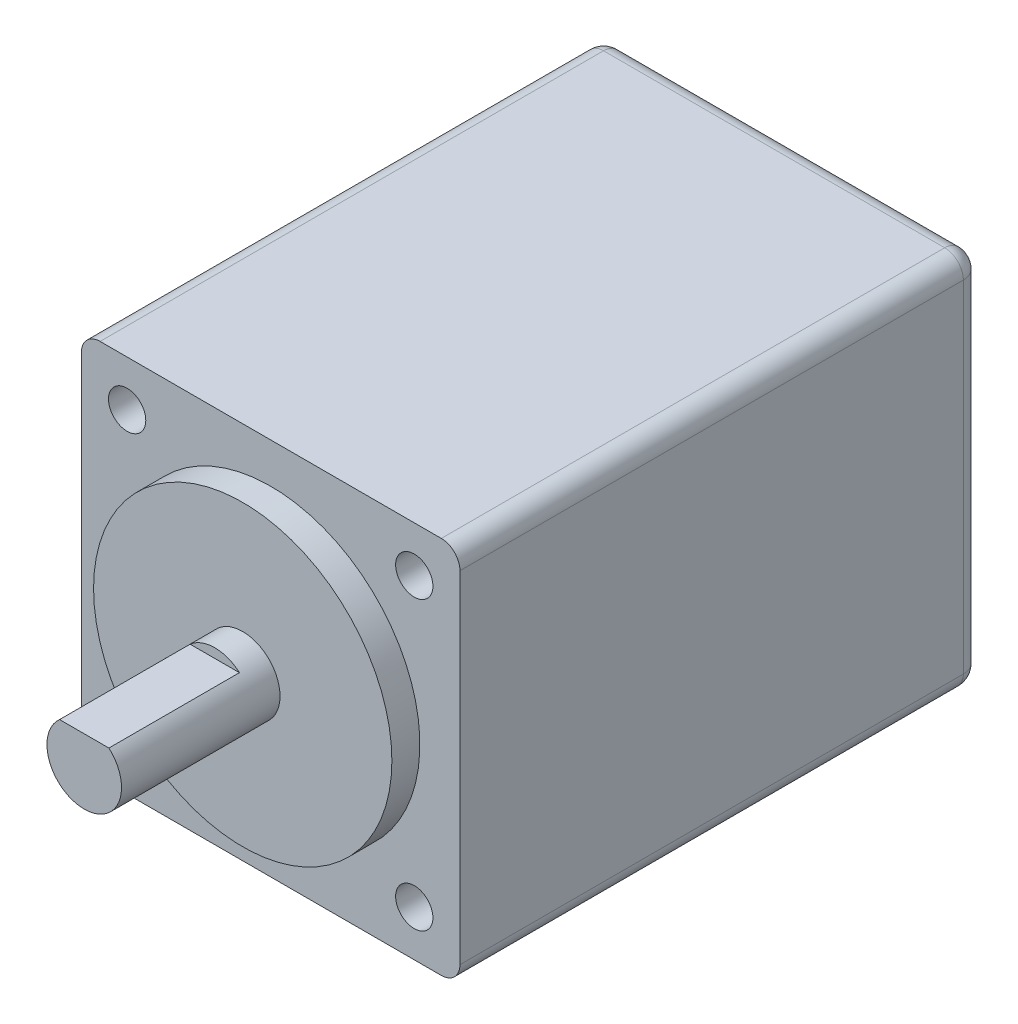
ISO-10303-21;
HEADER;
FILE_DESCRIPTION(('STEP AP214'),'2;1');
FILE_NAME('part.step','',(''),(''),'','','');
FILE_SCHEMA(('AUTOMOTIVE_DESIGN { 1 0 10303 214 1 1 1 1 }'));
ENDSEC;
DATA;
#1=APPLICATION_CONTEXT('core data for automotive mechanical design processes');
#2=APPLICATION_PROTOCOL_DEFINITION('international standard','automotive_design',2000,#1);
#3=PRODUCT_CONTEXT('',#1,'mechanical');
#4=PRODUCT('Part','Part','',(#3));
#5=PRODUCT_RELATED_PRODUCT_CATEGORY('part','',(#4));
#6=PRODUCT_DEFINITION_FORMATION('','',#4);
#7=PRODUCT_DEFINITION_CONTEXT('part definition',#1,'design');
#8=PRODUCT_DEFINITION('design','',#6,#7);
#9=PRODUCT_DEFINITION_SHAPE('','',#8);
#10=(LENGTH_UNIT() NAMED_UNIT(*) SI_UNIT(.MILLI.,.METRE.));
#11=(NAMED_UNIT(*) PLANE_ANGLE_UNIT() SI_UNIT($,.RADIAN.));
#12=(NAMED_UNIT(*) SI_UNIT($,.STERADIAN.) SOLID_ANGLE_UNIT());
#13=UNCERTAINTY_MEASURE_WITH_UNIT(LENGTH_MEASURE(1.E-05),#10,'distance_accuracy_value','');
#14=(GEOMETRIC_REPRESENTATION_CONTEXT(3) GLOBAL_UNCERTAINTY_ASSIGNED_CONTEXT((#13)) GLOBAL_UNIT_ASSIGNED_CONTEXT((#10,
#11,#12)) REPRESENTATION_CONTEXT('',''));
#15=CARTESIAN_POINT('',(0.,0.,0.));
#16=DIRECTION('',(0.,0.,1.));
#17=DIRECTION('',(1.,0.,0.));
#18=AXIS2_PLACEMENT_3D('',#15,#16,#17);
#19=CARTESIAN_POINT('',(0.,0.,29.5));
#20=DIRECTION('',(0.,0.,1.));
#21=DIRECTION('',(1.,0.,0.));
#22=AXIS2_PLACEMENT_3D('',#19,#20,#21);
#23=PLANE('',#22);
#24=CARTESIAN_POINT('',(0.,0.,29.5));
#25=DIRECTION('',(0.,0.,1.));
#26=DIRECTION('',(1.,0.,0.));
#27=AXIS2_PLACEMENT_3D('',#24,#25,#26);
#28=CIRCLE('',#27,8.);
#29=CARTESIAN_POINT('',(8.,0.,29.5));
#30=VERTEX_POINT('',#29);
#31=EDGE_CURVE('E144',#30,#30,#28,.T.);
#32=ORIENTED_EDGE('',*,*,#31,.T.);
#33=EDGE_LOOP('',(#32));
#34=FACE_BOUND('',#33,.T.);
#35=CARTESIAN_POINT('',(0.,0.,29.5));
#36=DIRECTION('',(0.,0.,1.));
#37=DIRECTION('',(1.,0.,0.));
#38=AXIS2_PLACEMENT_3D('',#35,#36,#37);
#39=CIRCLE('',#38,2.);
#40=CARTESIAN_POINT('',(2.,0.,29.5));
#41=VERTEX_POINT('',#40);
#42=EDGE_CURVE('E145',#41,#41,#39,.T.);
#43=ORIENTED_EDGE('',*,*,#42,.F.);
#44=EDGE_LOOP('',(#43));
#45=FACE_BOUND('',#44,.T.);
#46=ADVANCED_FACE('F33',(#34,#45),#23,.T.);
#47=CARTESIAN_POINT('',(10.15,10.15,28.));
#48=DIRECTION('',(0.,0.,-1.));
#49=DIRECTION('',(-1.,0.,0.));
#50=AXIS2_PLACEMENT_3D('',#47,#48,#49);
#51=PLANE('',#50);
#52=CARTESIAN_POINT('',(-7.69999999999969,-7.7,28.));
#53=DIRECTION('',(0.,0.,1.));
#54=DIRECTION('',(1.,0.,0.));
#55=AXIS2_PLACEMENT_3D('',#52,#53,#54);
#56=CIRCLE('',#55,1.);
#57=CARTESIAN_POINT('',(-6.69999999999969,-7.7,28.));
#58=VERTEX_POINT('',#57);
#59=EDGE_CURVE('E237',#58,#58,#56,.T.);
#60=ORIENTED_EDGE('',*,*,#59,.F.);
#61=EDGE_LOOP('',(#60));
#62=FACE_BOUND('',#61,.T.);
#63=CARTESIAN_POINT('',(7.70000000000031,-7.69999999999969,28.));
#64=DIRECTION('',(0.,0.,1.));
#65=DIRECTION('',(1.,0.,0.));
#66=AXIS2_PLACEMENT_3D('',#63,#64,#65);
#67=CIRCLE('',#66,1.);
#68=CARTESIAN_POINT('',(8.70000000000032,-7.69999999999969,28.));
#69=VERTEX_POINT('',#68);
#70=EDGE_CURVE('E245',#69,#69,#67,.T.);
#71=ORIENTED_EDGE('',*,*,#70,.F.);
#72=EDGE_LOOP('',(#71));
#73=FACE_BOUND('',#72,.T.);
#74=CARTESIAN_POINT('',(7.7,7.70000000000031,28.));
#75=DIRECTION('',(0.,0.,1.));
#76=DIRECTION('',(1.,0.,0.));
#77=AXIS2_PLACEMENT_3D('',#74,#75,#76);
#78=CIRCLE('',#77,1.);
#79=CARTESIAN_POINT('',(8.7,7.70000000000031,28.));
#80=VERTEX_POINT('',#79);
#81=EDGE_CURVE('E251',#80,#80,#78,.T.);
#82=ORIENTED_EDGE('',*,*,#81,.F.);
#83=EDGE_LOOP('',(#82));
#84=FACE_BOUND('',#83,.T.);
#85=CARTESIAN_POINT('',(-7.7,7.7,28.));
#86=DIRECTION('',(0.,0.,1.));
#87=DIRECTION('',(1.,0.,0.));
#88=AXIS2_PLACEMENT_3D('',#85,#86,#87);
#89=CIRCLE('',#88,1.);
#90=CARTESIAN_POINT('',(-6.7,7.7,28.));
#91=VERTEX_POINT('',#90);
#92=EDGE_CURVE('E257',#91,#91,#89,.T.);
#93=ORIENTED_EDGE('',*,*,#92,.F.);
#94=EDGE_LOOP('',(#93));
#95=FACE_BOUND('',#94,.T.);
#96=DIRECTION('',(0.,-1.,0.));
#97=VECTOR('',#96,1.);
#98=CARTESIAN_POINT('',(-10.15,-10.15,28.));
#99=LINE('',#98,#97);
#100=CARTESIAN_POINT('',(-10.15,9.15,28.));
#101=VERTEX_POINT('',#100);
#102=CARTESIAN_POINT('',(-10.15,-9.15,28.));
#103=VERTEX_POINT('',#102);
#104=EDGE_CURVE('E159',#101,#103,#99,.T.);
#105=ORIENTED_EDGE('',*,*,#104,.T.);
#106=CARTESIAN_POINT('',(-9.15,-9.15,28.));
#107=DIRECTION('',(0.,0.,-1.));
#108=DIRECTION('',(-1.,0.,0.));
#109=AXIS2_PLACEMENT_3D('',#106,#107,#108);
#110=CIRCLE('',#109,1.);
#111=CARTESIAN_POINT('',(-9.15,-10.15,28.));
#112=VERTEX_POINT('',#111);
#113=EDGE_CURVE('E11',#103,#112,#110,.F.);
#114=ORIENTED_EDGE('',*,*,#113,.T.);
#115=DIRECTION('',(1.,0.,0.));
#116=VECTOR('',#115,1.);
#117=CARTESIAN_POINT('',(-10.15,-10.15,28.));
#118=LINE('',#117,#116);
#119=CARTESIAN_POINT('',(9.15,-10.15,28.));
#120=VERTEX_POINT('',#119);
#121=EDGE_CURVE('E162',#112,#120,#118,.T.);
#122=ORIENTED_EDGE('',*,*,#121,.T.);
#123=CARTESIAN_POINT('',(9.15,-9.15,28.));
#124=DIRECTION('',(0.,0.,-1.));
#125=DIRECTION('',(-1.,0.,0.));
#126=AXIS2_PLACEMENT_3D('',#123,#124,#125);
#127=CIRCLE('',#126,1.);
#128=CARTESIAN_POINT('',(10.15,-9.15,28.));
#129=VERTEX_POINT('',#128);
#130=EDGE_CURVE('E42',#120,#129,#127,.F.);
#131=ORIENTED_EDGE('',*,*,#130,.T.);
#132=DIRECTION('',(0.,1.,0.));
#133=VECTOR('',#132,1.);
#134=CARTESIAN_POINT('',(10.15,-10.15,28.));
#135=LINE('',#134,#133);
#136=CARTESIAN_POINT('',(10.15,9.15,28.));
#137=VERTEX_POINT('',#136);
#138=EDGE_CURVE('E148',#129,#137,#135,.T.);
#139=ORIENTED_EDGE('',*,*,#138,.T.);
#140=CARTESIAN_POINT('',(9.15,9.15,28.));
#141=DIRECTION('',(0.,0.,-1.));
#142=DIRECTION('',(-1.,0.,0.));
#143=AXIS2_PLACEMENT_3D('',#140,#141,#142);
#144=CIRCLE('',#143,1.);
#145=CARTESIAN_POINT('',(9.15,10.15,28.));
#146=VERTEX_POINT('',#145);
#147=EDGE_CURVE('E200',#137,#146,#144,.F.);
#148=ORIENTED_EDGE('',*,*,#147,.T.);
#149=DIRECTION('',(-1.,0.,0.));
#150=VECTOR('',#149,1.);
#151=CARTESIAN_POINT('',(-10.15,10.15,28.));
#152=LINE('',#151,#150);
#153=CARTESIAN_POINT('',(-9.15,10.15,28.));
#154=VERTEX_POINT('',#153);
#155=EDGE_CURVE('E156',#146,#154,#152,.T.);
#156=ORIENTED_EDGE('',*,*,#155,.T.);
#157=CARTESIAN_POINT('',(-9.15,9.15,28.));
#158=DIRECTION('',(0.,0.,-1.));
#159=DIRECTION('',(-1.,0.,0.));
#160=AXIS2_PLACEMENT_3D('',#157,#158,#159);
#161=CIRCLE('',#160,1.);
#162=EDGE_CURVE('E202',#154,#101,#161,.F.);
#163=ORIENTED_EDGE('',*,*,#162,.T.);
#164=EDGE_LOOP('',(#105,#114,#122,#131,#139,#148,#156,#163));
#165=FACE_BOUND('',#164,.T.);
#166=CARTESIAN_POINT('',(0.,0.,28.));
#167=DIRECTION('',(0.,0.,-1.));
#168=DIRECTION('',(-1.,0.,0.));
#169=AXIS2_PLACEMENT_3D('',#166,#167,#168);
#170=CIRCLE('',#169,8.);
#171=CARTESIAN_POINT('',(-8.,0.,28.));
#172=VERTEX_POINT('',#171);
#173=EDGE_CURVE('E134',#172,#172,#170,.F.);
#174=ORIENTED_EDGE('',*,*,#173,.F.);
#175=EDGE_LOOP('',(#174));
#176=FACE_BOUND('',#175,.T.);
#177=ADVANCED_FACE('F278',(#62,#73,#84,#95,#165,#176),#51,.F.);
#178=CARTESIAN_POINT('',(10.15,-10.15,28.));
#179=DIRECTION('',(-1.,0.,0.));
#180=DIRECTION('',(0.,0.,1.));
#181=AXIS2_PLACEMENT_3D('',#178,#179,#180);
#182=PLANE('',#181);
#183=ORIENTED_EDGE('',*,*,#138,.F.);
#184=DIRECTION('',(0.,0.,-1.));
#185=VECTOR('',#184,1.);
#186=CARTESIAN_POINT('',(10.15,-9.15,28.));
#187=LINE('',#186,#185);
#188=CARTESIAN_POINT('',(10.15,-9.15,1.));
#189=VERTEX_POINT('',#188);
#190=EDGE_CURVE('E50',#129,#189,#187,.T.);
#191=ORIENTED_EDGE('',*,*,#190,.T.);
#192=DIRECTION('',(0.,1.,0.));
#193=VECTOR('',#192,1.);
#194=CARTESIAN_POINT('',(10.15,10.15,1.));
#195=LINE('',#194,#193);
#196=CARTESIAN_POINT('',(10.15,9.15,1.));
#197=VERTEX_POINT('',#196);
#198=EDGE_CURVE('E55',#189,#197,#195,.T.);
#199=ORIENTED_EDGE('',*,*,#198,.T.);
#200=DIRECTION('',(0.,0.,-1.));
#201=VECTOR('',#200,1.);
#202=CARTESIAN_POINT('',(10.15,9.15,28.));
#203=LINE('',#202,#201);
#204=EDGE_CURVE('E196',#197,#137,#203,.F.);
#205=ORIENTED_EDGE('',*,*,#204,.T.);
#206=EDGE_LOOP('',(#183,#191,#199,#205));
#207=FACE_BOUND('',#206,.T.);
#208=ADVANCED_FACE('F284',(#207),#182,.F.);
#209=CARTESIAN_POINT('',(-10.15,10.15,28.));
#210=DIRECTION('',(0.,-1.,0.));
#211=DIRECTION('',(0.,0.,-1.));
#212=AXIS2_PLACEMENT_3D('',#209,#210,#211);
#213=PLANE('',#212);
#214=DIRECTION('',(-1.,0.,0.));
#215=VECTOR('',#214,1.);
#216=CARTESIAN_POINT('',(-10.15,10.15,1.));
#217=LINE('',#216,#215);
#218=CARTESIAN_POINT('',(9.15,10.15,1.));
#219=VERTEX_POINT('',#218);
#220=CARTESIAN_POINT('',(-9.15,10.15,1.));
#221=VERTEX_POINT('',#220);
#222=EDGE_CURVE('E170',#219,#221,#217,.T.);
#223=ORIENTED_EDGE('',*,*,#222,.T.);
#224=DIRECTION('',(0.,0.,-1.));
#225=VECTOR('',#224,1.);
#226=CARTESIAN_POINT('',(-9.15,10.15,28.));
#227=LINE('',#226,#225);
#228=EDGE_CURVE('E173',#221,#154,#227,.F.);
#229=ORIENTED_EDGE('',*,*,#228,.T.);
#230=ORIENTED_EDGE('',*,*,#155,.F.);
#231=DIRECTION('',(0.,0.,-1.));
#232=VECTOR('',#231,1.);
#233=CARTESIAN_POINT('',(9.15,10.15,28.));
#234=LINE('',#233,#232);
#235=EDGE_CURVE('E168',#146,#219,#234,.T.);
#236=ORIENTED_EDGE('',*,*,#235,.T.);
#237=EDGE_LOOP('',(#223,#229,#230,#236));
#238=FACE_BOUND('',#237,.T.);
#239=ADVANCED_FACE('F305',(#238),#213,.F.);
#240=CARTESIAN_POINT('',(-10.15,-10.15,28.));
#241=DIRECTION('',(1.,0.,0.));
#242=DIRECTION('',(0.,0.,-1.));
#243=AXIS2_PLACEMENT_3D('',#240,#241,#242);
#244=PLANE('',#243);
#245=DIRECTION('',(0.,-1.,0.));
#246=VECTOR('',#245,1.);
#247=CARTESIAN_POINT('',(-10.15,-10.15,1.));
#248=LINE('',#247,#246);
#249=CARTESIAN_POINT('',(-10.15,9.15,1.));
#250=VERTEX_POINT('',#249);
#251=CARTESIAN_POINT('',(-10.15,-9.15,1.));
#252=VERTEX_POINT('',#251);
#253=EDGE_CURVE('E186',#250,#252,#248,.T.);
#254=ORIENTED_EDGE('',*,*,#253,.T.);
#255=DIRECTION('',(0.,0.,-1.));
#256=VECTOR('',#255,1.);
#257=CARTESIAN_POINT('',(-10.15,-9.15,28.));
#258=LINE('',#257,#256);
#259=EDGE_CURVE('E188',#252,#103,#258,.F.);
#260=ORIENTED_EDGE('',*,*,#259,.T.);
#261=ORIENTED_EDGE('',*,*,#104,.F.);
#262=DIRECTION('',(0.,0.,-1.));
#263=VECTOR('',#262,1.);
#264=CARTESIAN_POINT('',(-10.15,9.15,28.));
#265=LINE('',#264,#263);
#266=EDGE_CURVE('E184',#101,#250,#265,.T.);
#267=ORIENTED_EDGE('',*,*,#266,.T.);
#268=EDGE_LOOP('',(#254,#260,#261,#267));
#269=FACE_BOUND('',#268,.T.);
#270=ADVANCED_FACE('F301',(#269),#244,.F.);
#271=CARTESIAN_POINT('',(-10.15,-10.15,28.));
#272=DIRECTION('',(0.,1.,0.));
#273=DIRECTION('',(0.,0.,1.));
#274=AXIS2_PLACEMENT_3D('',#271,#272,#273);
#275=PLANE('',#274);
#276=ORIENTED_EDGE('',*,*,#121,.F.);
#277=DIRECTION('',(0.,0.,-1.));
#278=VECTOR('',#277,1.);
#279=CARTESIAN_POINT('',(-9.15,-10.15,28.));
#280=LINE('',#279,#278);
#281=CARTESIAN_POINT('',(-9.15,-10.15,1.));
#282=VERTEX_POINT('',#281);
#283=EDGE_CURVE('E194',#112,#282,#280,.T.);
#284=ORIENTED_EDGE('',*,*,#283,.T.);
#285=DIRECTION('',(1.,0.,0.));
#286=VECTOR('',#285,1.);
#287=CARTESIAN_POINT('',(10.15,-10.15,1.));
#288=LINE('',#287,#286);
#289=CARTESIAN_POINT('',(9.15,-10.15,1.));
#290=VERTEX_POINT('',#289);
#291=EDGE_CURVE('E192',#282,#290,#288,.T.);
#292=ORIENTED_EDGE('',*,*,#291,.T.);
#293=DIRECTION('',(0.,0.,-1.));
#294=VECTOR('',#293,1.);
#295=CARTESIAN_POINT('',(9.15,-10.15,28.));
#296=LINE('',#295,#294);
#297=EDGE_CURVE('E190',#290,#120,#296,.F.);
#298=ORIENTED_EDGE('',*,*,#297,.T.);
#299=EDGE_LOOP('',(#276,#284,#292,#298));
#300=FACE_BOUND('',#299,.T.);
#301=ADVANCED_FACE('F297',(#300),#275,.F.);
#302=CARTESIAN_POINT('',(10.15,10.15,0.));
#303=DIRECTION('',(0.,0.,-1.));
#304=DIRECTION('',(-1.,0.,0.));
#305=AXIS2_PLACEMENT_3D('',#302,#303,#304);
#306=PLANE('',#305);
#307=DIRECTION('',(0.,-1.,0.));
#308=VECTOR('',#307,1.);
#309=CARTESIAN_POINT('',(-9.15,10.15,0.));
#310=LINE('',#309,#308);
#311=CARTESIAN_POINT('',(-9.15,-9.15,0.));
#312=VERTEX_POINT('',#311);
#313=CARTESIAN_POINT('',(-9.15,9.15,0.));
#314=VERTEX_POINT('',#313);
#315=EDGE_CURVE('E179',#312,#314,#310,.F.);
#316=ORIENTED_EDGE('',*,*,#315,.T.);
#317=DIRECTION('',(-1.,0.,0.));
#318=VECTOR('',#317,1.);
#319=CARTESIAN_POINT('',(10.15,9.15,0.));
#320=LINE('',#319,#318);
#321=CARTESIAN_POINT('',(9.15,9.15,0.));
#322=VERTEX_POINT('',#321);
#323=EDGE_CURVE('E181',#314,#322,#320,.F.);
#324=ORIENTED_EDGE('',*,*,#323,.T.);
#325=DIRECTION('',(0.,1.,0.));
#326=VECTOR('',#325,1.);
#327=CARTESIAN_POINT('',(9.15,-10.15,0.));
#328=LINE('',#327,#326);
#329=CARTESIAN_POINT('',(9.15,-9.15,0.));
#330=VERTEX_POINT('',#329);
#331=EDGE_CURVE('E175',#322,#330,#328,.F.);
#332=ORIENTED_EDGE('',*,*,#331,.T.);
#333=DIRECTION('',(1.,0.,0.));
#334=VECTOR('',#333,1.);
#335=CARTESIAN_POINT('',(-10.15,-9.15,0.));
#336=LINE('',#335,#334);
#337=EDGE_CURVE('E177',#330,#312,#336,.F.);
#338=ORIENTED_EDGE('',*,*,#337,.T.);
#339=EDGE_LOOP('',(#316,#324,#332,#338));
#340=FACE_BOUND('',#339,.T.);
#341=ADVANCED_FACE('F292',(#340),#306,.T.);
#342=CARTESIAN_POINT('',(0.,0.,29.5));
#343=DIRECTION('',(0.,0.,-1.));
#344=DIRECTION('',(-1.,0.,0.));
#345=AXIS2_PLACEMENT_3D('',#342,#343,#344);
#346=CYLINDRICAL_SURFACE('',#345,8.);
#347=ORIENTED_EDGE('',*,*,#31,.F.);
#348=EDGE_LOOP('',(#347));
#349=FACE_BOUND('',#348,.T.);
#350=ORIENTED_EDGE('',*,*,#173,.T.);
#351=EDGE_LOOP('',(#350));
#352=FACE_BOUND('',#351,.T.);
#353=ADVANCED_FACE('F290',(#349,#352),#346,.T.);
#354=CARTESIAN_POINT('',(0.,0.,38.));
#355=DIRECTION('',(0.,0.,-1.));
#356=DIRECTION('',(-1.,0.,0.));
#357=AXIS2_PLACEMENT_3D('',#354,#355,#356);
#358=CYLINDRICAL_SURFACE('',#357,2.);
#359=CARTESIAN_POINT('',(0.,0.,38.));
#360=DIRECTION('',(0.,0.,1.));
#361=DIRECTION('',(1.,0.,0.));
#362=AXIS2_PLACEMENT_3D('',#359,#360,#361);
#363=CIRCLE('',#362,2.);
#364=CARTESIAN_POINT('',(-1.3228756555323,1.5,38.));
#365=VERTEX_POINT('',#364);
#366=CARTESIAN_POINT('',(1.3228756555323,1.5,38.));
#367=VERTEX_POINT('',#366);
#368=EDGE_CURVE('E140',#365,#367,#363,.T.);
#369=ORIENTED_EDGE('',*,*,#368,.F.);
#370=DIRECTION('',(0.,0.,-1.));
#371=VECTOR('',#370,1.);
#372=CARTESIAN_POINT('',(-1.3228756555323,1.5,38.));
#373=LINE('',#372,#371);
#374=CARTESIAN_POINT('',(-1.3228756555323,1.5,31.));
#375=VERTEX_POINT('',#374);
#376=EDGE_CURVE('E129',#365,#375,#373,.T.);
#377=ORIENTED_EDGE('',*,*,#376,.T.);
#378=CARTESIAN_POINT('',(0.,0.,31.));
#379=DIRECTION('',(0.,0.,-1.));
#380=DIRECTION('',(-1.,0.,0.));
#381=AXIS2_PLACEMENT_3D('',#378,#379,#380);
#382=CIRCLE('',#381,2.);
#383=CARTESIAN_POINT('',(1.3228756555323,1.5,31.));
#384=VERTEX_POINT('',#383);
#385=EDGE_CURVE('E133',#375,#384,#382,.T.);
#386=ORIENTED_EDGE('',*,*,#385,.T.);
#387=DIRECTION('',(0.,0.,-1.));
#388=VECTOR('',#387,1.);
#389=CARTESIAN_POINT('',(1.3228756555323,1.5,38.));
#390=LINE('',#389,#388);
#391=EDGE_CURVE('E126',#384,#367,#390,.F.);
#392=ORIENTED_EDGE('',*,*,#391,.T.);
#393=EDGE_LOOP('',(#369,#377,#386,#392));
#394=FACE_BOUND('',#393,.T.);
#395=ORIENTED_EDGE('',*,*,#42,.T.);
#396=EDGE_LOOP('',(#395));
#397=FACE_BOUND('',#396,.T.);
#398=ADVANCED_FACE('F138',(#394,#397),#358,.T.);
#399=CARTESIAN_POINT('',(0.,0.,38.));
#400=DIRECTION('',(0.,0.,1.));
#401=DIRECTION('',(1.,0.,0.));
#402=AXIS2_PLACEMENT_3D('',#399,#400,#401);
#403=PLANE('',#402);
#404=DIRECTION('',(1.,0.,0.));
#405=VECTOR('',#404,1.);
#406=CARTESIAN_POINT('',(0.,1.5,38.));
#407=LINE('',#406,#405);
#408=EDGE_CURVE('E122',#365,#367,#407,.T.);
#409=ORIENTED_EDGE('',*,*,#408,.F.);
#410=ORIENTED_EDGE('',*,*,#368,.T.);
#411=EDGE_LOOP('',(#409,#410));
#412=FACE_BOUND('',#411,.T.);
#413=ADVANCED_FACE('F143',(#412),#403,.T.);
#414=CARTESIAN_POINT('',(-5.,2.,31.));
#415=DIRECTION('',(0.,0.,-1.));
#416=DIRECTION('',(-1.,0.,0.));
#417=AXIS2_PLACEMENT_3D('',#414,#415,#416);
#418=PLANE('',#417);
#419=DIRECTION('',(1.,0.,0.));
#420=VECTOR('',#419,1.);
#421=CARTESIAN_POINT('',(-5.,1.5,31.));
#422=LINE('',#421,#420);
#423=EDGE_CURVE('E141',#375,#384,#422,.T.);
#424=ORIENTED_EDGE('',*,*,#423,.T.);
#425=ORIENTED_EDGE('',*,*,#385,.F.);
#426=EDGE_LOOP('',(#424,#425));
#427=FACE_BOUND('',#426,.T.);
#428=ADVANCED_FACE('F266',(#427),#418,.F.);
#429=CARTESIAN_POINT('',(-5.,1.5,38.));
#430=DIRECTION('',(0.,-1.,0.));
#431=DIRECTION('',(0.,0.,-1.));
#432=AXIS2_PLACEMENT_3D('',#429,#430,#431);
#433=PLANE('',#432);
#434=ORIENTED_EDGE('',*,*,#408,.T.);
#435=ORIENTED_EDGE('',*,*,#391,.F.);
#436=ORIENTED_EDGE('',*,*,#423,.F.);
#437=ORIENTED_EDGE('',*,*,#376,.F.);
#438=EDGE_LOOP('',(#434,#435,#436,#437));
#439=FACE_BOUND('',#438,.T.);
#440=ADVANCED_FACE('F124',(#439),#433,.F.);
#441=CARTESIAN_POINT('',(-7.7,7.7,25.5));
#442=DIRECTION('',(0.,0.,1.));
#443=DIRECTION('',(1.,0.,0.));
#444=AXIS2_PLACEMENT_3D('',#441,#442,#443);
#445=CYLINDRICAL_SURFACE('',#444,1.);
#446=CARTESIAN_POINT('',(-7.7,7.7,25.5));
#447=DIRECTION('',(0.,0.,1.));
#448=DIRECTION('',(1.,0.,0.));
#449=AXIS2_PLACEMENT_3D('',#446,#447,#448);
#450=CIRCLE('',#449,1.);
#451=CARTESIAN_POINT('',(-6.7,7.7,25.5));
#452=VERTEX_POINT('',#451);
#453=EDGE_CURVE('E260',#452,#452,#450,.T.);
#454=ORIENTED_EDGE('',*,*,#453,.F.);
#455=EDGE_LOOP('',(#454));
#456=FACE_BOUND('',#455,.T.);
#457=ORIENTED_EDGE('',*,*,#92,.T.);
#458=EDGE_LOOP('',(#457));
#459=FACE_BOUND('',#458,.T.);
#460=ADVANCED_FACE('F273',(#456,#459),#445,.F.);
#461=CARTESIAN_POINT('',(-7.7,7.7,25.5));
#462=DIRECTION('',(0.,0.,1.));
#463=DIRECTION('',(1.,0.,0.));
#464=AXIS2_PLACEMENT_3D('',#461,#462,#463);
#465=PLANE('',#464);
#466=ORIENTED_EDGE('',*,*,#453,.T.);
#467=EDGE_LOOP('',(#466));
#468=FACE_BOUND('',#467,.T.);
#469=ADVANCED_FACE('F418',(#468),#465,.T.);
#470=CARTESIAN_POINT('',(7.7,7.70000000000031,25.5));
#471=DIRECTION('',(0.,0.,1.));
#472=DIRECTION('',(1.,0.,0.));
#473=AXIS2_PLACEMENT_3D('',#470,#471,#472);
#474=CYLINDRICAL_SURFACE('',#473,1.);
#475=CARTESIAN_POINT('',(7.7,7.70000000000031,25.5));
#476=DIRECTION('',(0.,0.,1.));
#477=DIRECTION('',(1.,0.,0.));
#478=AXIS2_PLACEMENT_3D('',#475,#476,#477);
#479=CIRCLE('',#478,1.);
#480=CARTESIAN_POINT('',(8.7,7.70000000000031,25.5));
#481=VERTEX_POINT('',#480);
#482=EDGE_CURVE('E254',#481,#481,#479,.T.);
#483=ORIENTED_EDGE('',*,*,#482,.F.);
#484=EDGE_LOOP('',(#483));
#485=FACE_BOUND('',#484,.T.);
#486=ORIENTED_EDGE('',*,*,#81,.T.);
#487=EDGE_LOOP('',(#486));
#488=FACE_BOUND('',#487,.T.);
#489=ADVANCED_FACE('F414',(#485,#488),#474,.F.);
#490=CARTESIAN_POINT('',(7.7,7.70000000000031,25.5));
#491=DIRECTION('',(0.,0.,1.));
#492=DIRECTION('',(1.,0.,0.));
#493=AXIS2_PLACEMENT_3D('',#490,#491,#492);
#494=PLANE('',#493);
#495=ORIENTED_EDGE('',*,*,#482,.T.);
#496=EDGE_LOOP('',(#495));
#497=FACE_BOUND('',#496,.T.);
#498=ADVANCED_FACE('F410',(#497),#494,.T.);
#499=CARTESIAN_POINT('',(7.70000000000031,-7.69999999999969,25.5));
#500=DIRECTION('',(0.,0.,1.));
#501=DIRECTION('',(1.,0.,0.));
#502=AXIS2_PLACEMENT_3D('',#499,#500,#501);
#503=CYLINDRICAL_SURFACE('',#502,1.);
#504=CARTESIAN_POINT('',(7.70000000000031,-7.69999999999969,25.5));
#505=DIRECTION('',(0.,0.,1.));
#506=DIRECTION('',(1.,0.,0.));
#507=AXIS2_PLACEMENT_3D('',#504,#505,#506);
#508=CIRCLE('',#507,1.);
#509=CARTESIAN_POINT('',(8.70000000000032,-7.69999999999969,25.5));
#510=VERTEX_POINT('',#509);
#511=EDGE_CURVE('E248',#510,#510,#508,.T.);
#512=ORIENTED_EDGE('',*,*,#511,.F.);
#513=EDGE_LOOP('',(#512));
#514=FACE_BOUND('',#513,.T.);
#515=ORIENTED_EDGE('',*,*,#70,.T.);
#516=EDGE_LOOP('',(#515));
#517=FACE_BOUND('',#516,.T.);
#518=ADVANCED_FACE('F406',(#514,#517),#503,.F.);
#519=CARTESIAN_POINT('',(7.70000000000031,-7.69999999999969,25.5));
#520=DIRECTION('',(0.,0.,1.));
#521=DIRECTION('',(1.,0.,0.));
#522=AXIS2_PLACEMENT_3D('',#519,#520,#521);
#523=PLANE('',#522);
#524=ORIENTED_EDGE('',*,*,#511,.T.);
#525=EDGE_LOOP('',(#524));
#526=FACE_BOUND('',#525,.T.);
#527=ADVANCED_FACE('F400',(#526),#523,.T.);
#528=CARTESIAN_POINT('',(-7.69999999999969,-7.7,25.5));
#529=DIRECTION('',(0.,0.,1.));
#530=DIRECTION('',(1.,0.,0.));
#531=AXIS2_PLACEMENT_3D('',#528,#529,#530);
#532=CYLINDRICAL_SURFACE('',#531,1.);
#533=CARTESIAN_POINT('',(-7.69999999999969,-7.7,25.5));
#534=DIRECTION('',(0.,0.,1.));
#535=DIRECTION('',(1.,0.,0.));
#536=AXIS2_PLACEMENT_3D('',#533,#534,#535);
#537=CIRCLE('',#536,1.);
#538=CARTESIAN_POINT('',(-6.69999999999969,-7.7,25.5));
#539=VERTEX_POINT('',#538);
#540=EDGE_CURVE('E240',#539,#539,#537,.T.);
#541=ORIENTED_EDGE('',*,*,#540,.F.);
#542=EDGE_LOOP('',(#541));
#543=FACE_BOUND('',#542,.T.);
#544=ORIENTED_EDGE('',*,*,#59,.T.);
#545=EDGE_LOOP('',(#544));
#546=FACE_BOUND('',#545,.T.);
#547=ADVANCED_FACE('F394',(#543,#546),#532,.F.);
#548=CARTESIAN_POINT('',(-7.69999999999969,-7.7,25.5));
#549=DIRECTION('',(0.,0.,1.));
#550=DIRECTION('',(1.,0.,0.));
#551=AXIS2_PLACEMENT_3D('',#548,#549,#550);
#552=PLANE('',#551);
#553=ORIENTED_EDGE('',*,*,#540,.T.);
#554=EDGE_LOOP('',(#553));
#555=FACE_BOUND('',#554,.T.);
#556=ADVANCED_FACE('F356',(#555),#552,.T.);
#557=CARTESIAN_POINT('',(9.15,-9.15,28.));
#558=DIRECTION('',(0.,0.,-1.));
#559=DIRECTION('',(-1.,0.,0.));
#560=AXIS2_PLACEMENT_3D('',#557,#558,#559);
#561=CYLINDRICAL_SURFACE('',#560,1.);
#562=ORIENTED_EDGE('',*,*,#130,.F.);
#563=ORIENTED_EDGE('',*,*,#297,.F.);
#564=CARTESIAN_POINT('',(9.15,-9.15,1.));
#565=DIRECTION('',(0.,0.,-1.));
#566=DIRECTION('',(-1.,0.,0.));
#567=AXIS2_PLACEMENT_3D('',#564,#565,#566);
#568=CIRCLE('',#567,1.);
#569=EDGE_CURVE('E232',#189,#290,#568,.T.);
#570=ORIENTED_EDGE('',*,*,#569,.F.);
#571=ORIENTED_EDGE('',*,*,#190,.F.);
#572=EDGE_LOOP('',(#562,#563,#570,#571));
#573=FACE_BOUND('',#572,.T.);
#574=ADVANCED_FACE('F35',(#573),#561,.T.);
#575=CARTESIAN_POINT('',(-9.15,-9.15,28.));
#576=DIRECTION('',(0.,0.,-1.));
#577=DIRECTION('',(-1.,0.,0.));
#578=AXIS2_PLACEMENT_3D('',#575,#576,#577);
#579=CYLINDRICAL_SURFACE('',#578,1.);
#580=ORIENTED_EDGE('',*,*,#113,.F.);
#581=ORIENTED_EDGE('',*,*,#259,.F.);
#582=CARTESIAN_POINT('',(-9.15,-9.15,1.));
#583=DIRECTION('',(0.,0.,-1.));
#584=DIRECTION('',(-1.,0.,0.));
#585=AXIS2_PLACEMENT_3D('',#582,#583,#584);
#586=CIRCLE('',#585,1.);
#587=EDGE_CURVE('E230',#282,#252,#586,.T.);
#588=ORIENTED_EDGE('',*,*,#587,.F.);
#589=ORIENTED_EDGE('',*,*,#283,.F.);
#590=EDGE_LOOP('',(#580,#581,#588,#589));
#591=FACE_BOUND('',#590,.T.);
#592=ADVANCED_FACE('F349',(#591),#579,.T.);
#593=CARTESIAN_POINT('',(-10.15,-9.15,1.));
#594=DIRECTION('',(-1.,0.,0.));
#595=DIRECTION('',(0.,0.,1.));
#596=AXIS2_PLACEMENT_3D('',#593,#594,#595);
#597=CYLINDRICAL_SURFACE('',#596,1.);
#598=CARTESIAN_POINT('',(9.15,-9.15,1.));
#599=DIRECTION('',(1.,0.,0.));
#600=DIRECTION('',(0.,0.,-1.));
#601=AXIS2_PLACEMENT_3D('',#598,#599,#600);
#602=CIRCLE('',#601,1.);
#603=EDGE_CURVE('E37',#290,#330,#602,.T.);
#604=ORIENTED_EDGE('',*,*,#603,.F.);
#605=ORIENTED_EDGE('',*,*,#291,.F.);
#606=CARTESIAN_POINT('',(-9.15,-9.15,1.));
#607=DIRECTION('',(-1.,0.,0.));
#608=DIRECTION('',(0.,0.,1.));
#609=AXIS2_PLACEMENT_3D('',#606,#607,#608);
#610=CIRCLE('',#609,1.);
#611=EDGE_CURVE('E227',#312,#282,#610,.T.);
#612=ORIENTED_EDGE('',*,*,#611,.F.);
#613=ORIENTED_EDGE('',*,*,#337,.F.);
#614=EDGE_LOOP('',(#604,#605,#612,#613));
#615=FACE_BOUND('',#614,.T.);
#616=ADVANCED_FACE('F347',(#615),#597,.T.);
#617=CARTESIAN_POINT('',(9.15,-9.15,1.));
#618=DIRECTION('',(0.,0.,1.));
#619=DIRECTION('',(1.,0.,0.));
#620=AXIS2_PLACEMENT_3D('',#617,#618,#619);
#621=SPHERICAL_SURFACE('',#620,1.);
#622=ORIENTED_EDGE('',*,*,#569,.T.);
#623=ORIENTED_EDGE('',*,*,#603,.T.);
#624=CARTESIAN_POINT('',(9.15,-9.15,1.));
#625=DIRECTION('',(0.,-1.,0.));
#626=DIRECTION('',(0.,0.,-1.));
#627=AXIS2_PLACEMENT_3D('',#624,#625,#626);
#628=CIRCLE('',#627,1.);
#629=EDGE_CURVE('E224',#189,#330,#628,.F.);
#630=ORIENTED_EDGE('',*,*,#629,.F.);
#631=EDGE_LOOP('',(#622,#623,#630));
#632=FACE_BOUND('',#631,.T.);
#633=ADVANCED_FACE('F343',(#632),#621,.T.);
#634=CARTESIAN_POINT('',(-9.15,-9.15,1.));
#635=DIRECTION('',(0.,0.,1.));
#636=DIRECTION('',(1.,0.,0.));
#637=AXIS2_PLACEMENT_3D('',#634,#635,#636);
#638=SPHERICAL_SURFACE('',#637,1.);
#639=ORIENTED_EDGE('',*,*,#611,.T.);
#640=ORIENTED_EDGE('',*,*,#587,.T.);
#641=CARTESIAN_POINT('',(-9.15,-9.15,1.));
#642=DIRECTION('',(0.,-1.,0.));
#643=DIRECTION('',(0.,0.,-1.));
#644=AXIS2_PLACEMENT_3D('',#641,#642,#643);
#645=CIRCLE('',#644,1.);
#646=EDGE_CURVE('E221',#312,#252,#645,.F.);
#647=ORIENTED_EDGE('',*,*,#646,.F.);
#648=EDGE_LOOP('',(#639,#640,#647));
#649=FACE_BOUND('',#648,.T.);
#650=ADVANCED_FACE('F339',(#649),#638,.T.);
#651=CARTESIAN_POINT('',(9.15,-10.15,1.));
#652=DIRECTION('',(0.,-1.,0.));
#653=DIRECTION('',(0.,0.,-1.));
#654=AXIS2_PLACEMENT_3D('',#651,#652,#653);
#655=CYLINDRICAL_SURFACE('',#654,1.);
#656=ORIENTED_EDGE('',*,*,#629,.T.);
#657=ORIENTED_EDGE('',*,*,#331,.F.);
#658=CARTESIAN_POINT('',(9.15,9.15,1.));
#659=DIRECTION('',(0.,1.,0.));
#660=DIRECTION('',(0.,0.,1.));
#661=AXIS2_PLACEMENT_3D('',#658,#659,#660);
#662=CIRCLE('',#661,1.);
#663=EDGE_CURVE('E218',#197,#322,#662,.T.);
#664=ORIENTED_EDGE('',*,*,#663,.F.);
#665=ORIENTED_EDGE('',*,*,#198,.F.);
#666=EDGE_LOOP('',(#656,#657,#664,#665));
#667=FACE_BOUND('',#666,.T.);
#668=ADVANCED_FACE('F335',(#667),#655,.T.);
#669=CARTESIAN_POINT('',(9.15,9.15,28.));
#670=DIRECTION('',(0.,0.,-1.));
#671=DIRECTION('',(-1.,0.,0.));
#672=AXIS2_PLACEMENT_3D('',#669,#670,#671);
#673=CYLINDRICAL_SURFACE('',#672,1.);
#674=ORIENTED_EDGE('',*,*,#147,.F.);
#675=ORIENTED_EDGE('',*,*,#204,.F.);
#676=CARTESIAN_POINT('',(9.15,9.15,1.));
#677=DIRECTION('',(0.,0.,-1.));
#678=DIRECTION('',(-1.,0.,0.));
#679=AXIS2_PLACEMENT_3D('',#676,#677,#678);
#680=CIRCLE('',#679,1.);
#681=EDGE_CURVE('E215',#219,#197,#680,.T.);
#682=ORIENTED_EDGE('',*,*,#681,.F.);
#683=ORIENTED_EDGE('',*,*,#235,.F.);
#684=EDGE_LOOP('',(#674,#675,#682,#683));
#685=FACE_BOUND('',#684,.T.);
#686=ADVANCED_FACE('F331',(#685),#673,.T.);
#687=CARTESIAN_POINT('',(-9.15,9.15,28.));
#688=DIRECTION('',(0.,0.,-1.));
#689=DIRECTION('',(-1.,0.,0.));
#690=AXIS2_PLACEMENT_3D('',#687,#688,#689);
#691=CYLINDRICAL_SURFACE('',#690,1.);
#692=ORIENTED_EDGE('',*,*,#162,.F.);
#693=ORIENTED_EDGE('',*,*,#228,.F.);
#694=CARTESIAN_POINT('',(-9.15,9.15,1.));
#695=DIRECTION('',(0.,0.,-1.));
#696=DIRECTION('',(-1.,0.,0.));
#697=AXIS2_PLACEMENT_3D('',#694,#695,#696);
#698=CIRCLE('',#697,1.);
#699=EDGE_CURVE('E212',#250,#221,#698,.T.);
#700=ORIENTED_EDGE('',*,*,#699,.F.);
#701=ORIENTED_EDGE('',*,*,#266,.F.);
#702=EDGE_LOOP('',(#692,#693,#700,#701));
#703=FACE_BOUND('',#702,.T.);
#704=ADVANCED_FACE('F327',(#703),#691,.T.);
#705=CARTESIAN_POINT('',(-9.15,-10.15,1.));
#706=DIRECTION('',(0.,1.,0.));
#707=DIRECTION('',(0.,0.,1.));
#708=AXIS2_PLACEMENT_3D('',#705,#706,#707);
#709=CYLINDRICAL_SURFACE('',#708,1.);
#710=ORIENTED_EDGE('',*,*,#646,.T.);
#711=ORIENTED_EDGE('',*,*,#253,.F.);
#712=CARTESIAN_POINT('',(-9.15,9.15,1.));
#713=DIRECTION('',(0.,1.,0.));
#714=DIRECTION('',(0.,0.,1.));
#715=AXIS2_PLACEMENT_3D('',#712,#713,#714);
#716=CIRCLE('',#715,1.);
#717=EDGE_CURVE('E209',#314,#250,#716,.T.);
#718=ORIENTED_EDGE('',*,*,#717,.F.);
#719=ORIENTED_EDGE('',*,*,#315,.F.);
#720=EDGE_LOOP('',(#710,#711,#718,#719));
#721=FACE_BOUND('',#720,.T.);
#722=ADVANCED_FACE('F323',(#721),#709,.T.);
#723=CARTESIAN_POINT('',(9.15,9.15,1.));
#724=DIRECTION('',(0.,0.,1.));
#725=DIRECTION('',(1.,0.,0.));
#726=AXIS2_PLACEMENT_3D('',#723,#724,#725);
#727=SPHERICAL_SURFACE('',#726,1.);
#728=ORIENTED_EDGE('',*,*,#681,.T.);
#729=ORIENTED_EDGE('',*,*,#663,.T.);
#730=CARTESIAN_POINT('',(9.15,9.15,1.));
#731=DIRECTION('',(1.,0.,0.));
#732=DIRECTION('',(0.,0.,-1.));
#733=AXIS2_PLACEMENT_3D('',#730,#731,#732);
#734=CIRCLE('',#733,1.);
#735=EDGE_CURVE('E207',#219,#322,#734,.F.);
#736=ORIENTED_EDGE('',*,*,#735,.F.);
#737=EDGE_LOOP('',(#728,#729,#736));
#738=FACE_BOUND('',#737,.T.);
#739=ADVANCED_FACE('F319',(#738),#727,.T.);
#740=CARTESIAN_POINT('',(-9.15,9.15,1.));
#741=DIRECTION('',(0.,0.,1.));
#742=DIRECTION('',(1.,0.,0.));
#743=AXIS2_PLACEMENT_3D('',#740,#741,#742);
#744=SPHERICAL_SURFACE('',#743,1.);
#745=ORIENTED_EDGE('',*,*,#717,.T.);
#746=ORIENTED_EDGE('',*,*,#699,.T.);
#747=CARTESIAN_POINT('',(-9.15,9.15,1.));
#748=DIRECTION('',(-1.,0.,0.));
#749=DIRECTION('',(0.,0.,1.));
#750=AXIS2_PLACEMENT_3D('',#747,#748,#749);
#751=CIRCLE('',#750,1.);
#752=EDGE_CURVE('E205',#314,#221,#751,.F.);
#753=ORIENTED_EDGE('',*,*,#752,.F.);
#754=EDGE_LOOP('',(#745,#746,#753));
#755=FACE_BOUND('',#754,.T.);
#756=ADVANCED_FACE('F315',(#755),#744,.T.);
#757=CARTESIAN_POINT('',(-10.15,9.15,1.));
#758=DIRECTION('',(1.,0.,0.));
#759=DIRECTION('',(0.,0.,-1.));
#760=AXIS2_PLACEMENT_3D('',#757,#758,#759);
#761=CYLINDRICAL_SURFACE('',#760,1.);
#762=ORIENTED_EDGE('',*,*,#735,.T.);
#763=ORIENTED_EDGE('',*,*,#323,.F.);
#764=ORIENTED_EDGE('',*,*,#752,.T.);
#765=ORIENTED_EDGE('',*,*,#222,.F.);
#766=EDGE_LOOP('',(#762,#763,#764,#765));
#767=FACE_BOUND('',#766,.T.);
#768=ADVANCED_FACE('F312',(#767),#761,.T.);
#769=CLOSED_SHELL('',(#46,#177,#208,#239,#270,#301,#341,#353,#398,#413,#428,#440,#460,#469,#489,
#498,#518,#527,#547,#556,#574,#592,#616,#633,#650,#668,#686,#704,#722,#739,#756,#768));
#770=MANIFOLD_SOLID_BREP('B2',#769);
#771=ADVANCED_BREP_SHAPE_REPRESENTATION('',(#18,#770),#14);
#772=SHAPE_DEFINITION_REPRESENTATION(#9,#771);
ENDSEC;
END-ISO-10303-21;
